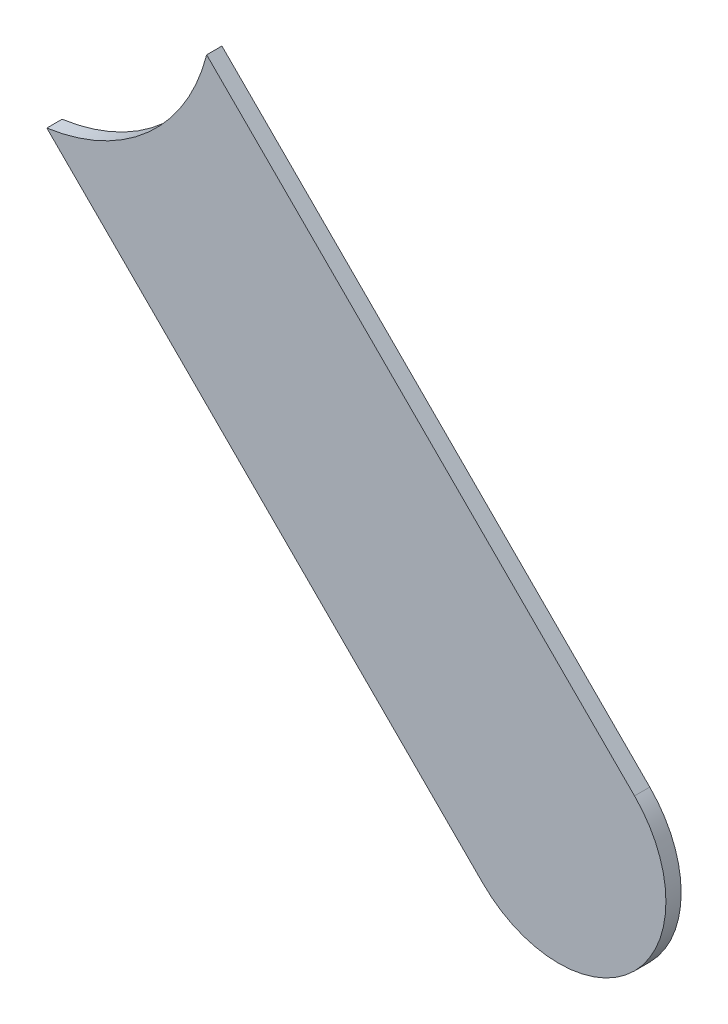
ISO-10303-21;
HEADER;
FILE_DESCRIPTION(('STEP AP214'),'2;1');
FILE_NAME('part.step','',(''),(''),'','','');
FILE_SCHEMA(('AUTOMOTIVE_DESIGN { 1 0 10303 214 1 1 1 1 }'));
ENDSEC;
DATA;
#1=APPLICATION_CONTEXT('core data for automotive mechanical design processes');
#2=APPLICATION_PROTOCOL_DEFINITION('international standard','automotive_design',2000,#1);
#3=PRODUCT_CONTEXT('',#1,'mechanical');
#4=PRODUCT('Part','Part','',(#3));
#5=PRODUCT_RELATED_PRODUCT_CATEGORY('part','',(#4));
#6=PRODUCT_DEFINITION_FORMATION('','',#4);
#7=PRODUCT_DEFINITION_CONTEXT('part definition',#1,'design');
#8=PRODUCT_DEFINITION('design','',#6,#7);
#9=PRODUCT_DEFINITION_SHAPE('','',#8);
#10=(LENGTH_UNIT() NAMED_UNIT(*) SI_UNIT(.MILLI.,.METRE.));
#11=(NAMED_UNIT(*) PLANE_ANGLE_UNIT() SI_UNIT($,.RADIAN.));
#12=(NAMED_UNIT(*) SI_UNIT($,.STERADIAN.) SOLID_ANGLE_UNIT());
#13=UNCERTAINTY_MEASURE_WITH_UNIT(LENGTH_MEASURE(1.E-05),#10,'distance_accuracy_value','');
#14=(GEOMETRIC_REPRESENTATION_CONTEXT(3) GLOBAL_UNCERTAINTY_ASSIGNED_CONTEXT((#13)) GLOBAL_UNIT_ASSIGNED_CONTEXT((#10,
#11,#12)) REPRESENTATION_CONTEXT('',''));
#15=CARTESIAN_POINT('',(0.,0.,0.));
#16=DIRECTION('',(0.,0.,1.));
#17=DIRECTION('',(1.,0.,0.));
#18=AXIS2_PLACEMENT_3D('',#15,#16,#17);
#19=CARTESIAN_POINT('',(48.1742417325165,108.962477267484,0.));
#20=DIRECTION('',(0.707106781186552,0.707106781186544,0.));
#21=DIRECTION('',(0.707106781186544,-0.707106781186552,0.));
#22=AXIS2_PLACEMENT_3D('',#19,#20,#21);
#23=PLANE('',#22);
#24=DIRECTION('',(0.707106781186544,-0.707106781186552,0.));
#25=VECTOR('',#24,1.);
#26=CARTESIAN_POINT('',(47.93422722,109.20249178,0.03556));
#27=LINE('',#26,#25);
#28=CARTESIAN_POINT('',(48.1742417325165,108.962477267484,0.03556));
#29=VERTEX_POINT('',#28);
#30=CARTESIAN_POINT('',(49.19148404,107.94523496,0.03556));
#31=VERTEX_POINT('',#30);
#32=EDGE_CURVE('E11',#29,#31,#27,.T.);
#33=ORIENTED_EDGE('',*,*,#32,.F.);
#34=DIRECTION('',(0.,0.,1.));
#35=VECTOR('',#34,1.);
#36=CARTESIAN_POINT('',(48.1742417325165,108.962477267484,0.));
#37=LINE('',#36,#35);
#38=CARTESIAN_POINT('',(48.1742417325165,108.962477267484,0.));
#39=VERTEX_POINT('',#38);
#40=EDGE_CURVE('E24',#39,#29,#37,.T.);
#41=ORIENTED_EDGE('',*,*,#40,.F.);
#42=DIRECTION('',(0.707106781186544,-0.707106781186552,0.));
#43=VECTOR('',#42,1.);
#44=CARTESIAN_POINT('',(47.93422722,109.20249178,0.));
#45=LINE('',#44,#43);
#46=CARTESIAN_POINT('',(49.19148404,107.94523496,0.));
#47=VERTEX_POINT('',#46);
#48=EDGE_CURVE('E75',#39,#47,#45,.T.);
#49=ORIENTED_EDGE('',*,*,#48,.T.);
#50=DIRECTION('',(0.,0.,1.));
#51=VECTOR('',#50,1.);
#52=CARTESIAN_POINT('',(49.19148404,107.94523496,0.));
#53=LINE('',#52,#51);
#54=EDGE_CURVE('E37',#47,#31,#53,.T.);
#55=ORIENTED_EDGE('',*,*,#54,.T.);
#56=EDGE_LOOP('',(#33,#41,#49,#55));
#57=FACE_BOUND('',#56,.T.);
#58=ADVANCED_FACE('F17',(#57),#23,.F.);
#59=CARTESIAN_POINT('',(49.36826042,108.12201134,0.));
#60=DIRECTION('',(0.,0.,-1.));
#61=DIRECTION('',(-0.707106781186533,-0.707106781186562,0.));
#62=AXIS2_PLACEMENT_3D('',#59,#60,#61);
#63=CYLINDRICAL_SURFACE('',#62,0.249999554103225);
#64=CARTESIAN_POINT('',(49.36826042,108.12201134,0.03556));
#65=DIRECTION('',(0.,0.,1.));
#66=DIRECTION('',(-0.707106781186533,-0.707106781186562,0.));
#67=AXIS2_PLACEMENT_3D('',#64,#65,#66);
#68=CIRCLE('',#67,0.249999554103225);
#69=CARTESIAN_POINT('',(49.5450368,108.29878772,0.03556));
#70=VERTEX_POINT('',#69);
#71=EDGE_CURVE('E83',#31,#70,#68,.T.);
#72=ORIENTED_EDGE('',*,*,#71,.F.);
#73=ORIENTED_EDGE('',*,*,#54,.F.);
#74=CARTESIAN_POINT('',(49.36826042,108.12201134,0.));
#75=DIRECTION('',(0.,0.,1.));
#76=DIRECTION('',(-0.707106781186533,-0.707106781186562,0.));
#77=AXIS2_PLACEMENT_3D('',#74,#75,#76);
#78=CIRCLE('',#77,0.249999554103225);
#79=CARTESIAN_POINT('',(49.5450368,108.29878772,0.));
#80=VERTEX_POINT('',#79);
#81=EDGE_CURVE('E81',#47,#80,#78,.T.);
#82=ORIENTED_EDGE('',*,*,#81,.T.);
#83=DIRECTION('',(0.,0.,1.));
#84=VECTOR('',#83,1.);
#85=CARTESIAN_POINT('',(49.5450368,108.29878772,0.));
#86=LINE('',#85,#84);
#87=EDGE_CURVE('E67',#80,#70,#86,.T.);
#88=ORIENTED_EDGE('',*,*,#87,.T.);
#89=EDGE_LOOP('',(#72,#73,#82,#88));
#90=FACE_BOUND('',#89,.T.);
#91=ADVANCED_FACE('F89',(#90),#63,.T.);
#92=CARTESIAN_POINT('',(49.5450368,108.29878772,0.));
#93=DIRECTION('',(-0.707106781186546,-0.70710678118655,0.));
#94=DIRECTION('',(-0.70710678118655,0.707106781186546,0.));
#95=AXIS2_PLACEMENT_3D('',#92,#93,#94);
#96=PLANE('',#95);
#97=DIRECTION('',(-0.70710678118655,0.707106781186545,0.));
#98=VECTOR('',#97,1.);
#99=CARTESIAN_POINT('',(49.5450368,108.29878772,0.03556));
#100=LINE('',#99,#98);
#101=CARTESIAN_POINT('',(48.5470401484782,109.296784371522,0.03556));
#102=VERTEX_POINT('',#101);
#103=EDGE_CURVE('E71',#70,#102,#100,.T.);
#104=ORIENTED_EDGE('',*,*,#103,.F.);
#105=ORIENTED_EDGE('',*,*,#87,.F.);
#106=DIRECTION('',(-0.70710678118655,0.707106781186545,0.));
#107=VECTOR('',#106,1.);
#108=CARTESIAN_POINT('',(49.5450368,108.29878772,0.));
#109=LINE('',#108,#107);
#110=CARTESIAN_POINT('',(48.5470401484782,109.296784371522,0.));
#111=VERTEX_POINT('',#110);
#112=EDGE_CURVE('E63',#80,#111,#109,.T.);
#113=ORIENTED_EDGE('',*,*,#112,.T.);
#114=DIRECTION('',(0.,0.,1.));
#115=VECTOR('',#114,1.);
#116=CARTESIAN_POINT('',(48.5470401484782,109.296784371522,0.));
#117=LINE('',#116,#115);
#118=EDGE_CURVE('E53',#111,#102,#117,.T.);
#119=ORIENTED_EDGE('',*,*,#118,.T.);
#120=EDGE_LOOP('',(#104,#105,#113,#119));
#121=FACE_BOUND('',#120,.T.);
#122=ADVANCED_FACE('F66',(#121),#96,.F.);
#123=CARTESIAN_POINT('',(48.1110036,109.4080108,0.));
#124=DIRECTION('',(0.,0.,-1.));
#125=DIRECTION('',(1.,0.,0.));
#126=AXIS2_PLACEMENT_3D('',#123,#124,#125);
#127=CYLINDRICAL_SURFACE('',#126,0.4499991);
#128=ORIENTED_EDGE('',*,*,#40,.T.);
#129=CARTESIAN_POINT('',(48.1110036,109.4080108,0.03556));
#130=DIRECTION('',(0.,0.,1.));
#131=DIRECTION('',(1.,0.,0.));
#132=AXIS2_PLACEMENT_3D('',#129,#130,#131);
#133=CIRCLE('',#132,0.4499991);
#134=EDGE_CURVE('E59',#29,#102,#133,.T.);
#135=ORIENTED_EDGE('',*,*,#134,.T.);
#136=ORIENTED_EDGE('',*,*,#118,.F.);
#137=CARTESIAN_POINT('',(48.1110036,109.4080108,0.));
#138=DIRECTION('',(0.,0.,1.));
#139=DIRECTION('',(1.,0.,0.));
#140=AXIS2_PLACEMENT_3D('',#137,#138,#139);
#141=CIRCLE('',#140,0.4499991);
#142=EDGE_CURVE('E57',#39,#111,#141,.T.);
#143=ORIENTED_EDGE('',*,*,#142,.F.);
#144=EDGE_LOOP('',(#128,#135,#136,#143));
#145=FACE_BOUND('',#144,.T.);
#146=ADVANCED_FACE('F55',(#145),#127,.F.);
#147=CARTESIAN_POINT('',(47.93422722,109.20249178,0.));
#148=DIRECTION('',(0.,0.,-1.));
#149=DIRECTION('',(-1.,0.,0.));
#150=AXIS2_PLACEMENT_3D('',#147,#148,#149);
#151=PLANE('',#150);
#152=ORIENTED_EDGE('',*,*,#48,.F.);
#153=ORIENTED_EDGE('',*,*,#142,.T.);
#154=ORIENTED_EDGE('',*,*,#112,.F.);
#155=ORIENTED_EDGE('',*,*,#81,.F.);
#156=EDGE_LOOP('',(#152,#153,#154,#155));
#157=FACE_BOUND('',#156,.T.);
#158=ADVANCED_FACE('F74',(#157),#151,.T.);
#159=CARTESIAN_POINT('',(47.93422722,109.20249178,0.03556));
#160=DIRECTION('',(0.,0.,-1.));
#161=DIRECTION('',(-1.,0.,0.));
#162=AXIS2_PLACEMENT_3D('',#159,#160,#161);
#163=PLANE('',#162);
#164=ORIENTED_EDGE('',*,*,#134,.F.);
#165=ORIENTED_EDGE('',*,*,#32,.T.);
#166=ORIENTED_EDGE('',*,*,#71,.T.);
#167=ORIENTED_EDGE('',*,*,#103,.T.);
#168=EDGE_LOOP('',(#164,#165,#166,#167));
#169=FACE_BOUND('',#168,.T.);
#170=ADVANCED_FACE('F91',(#169),#163,.F.);
#171=CLOSED_SHELL('',(#58,#91,#122,#146,#158,#170));
#172=MANIFOLD_SOLID_BREP('B1',#171);
#173=ADVANCED_BREP_SHAPE_REPRESENTATION('',(#18,#172),#14);
#174=SHAPE_DEFINITION_REPRESENTATION(#9,#173);
ENDSEC;
END-ISO-10303-21;
